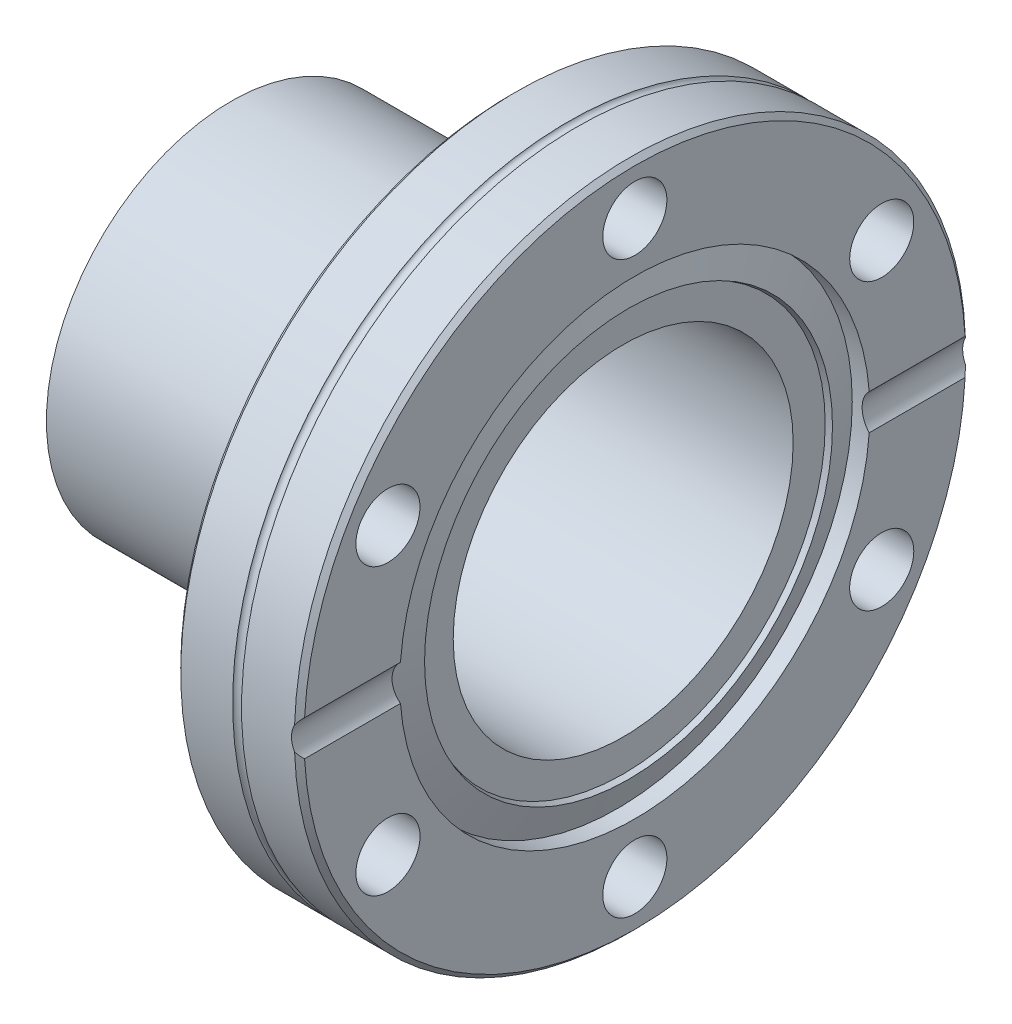
ISO-10303-21;
HEADER;
FILE_DESCRIPTION(('STEP AP214'),'2;1');
FILE_NAME('part.step','',(''),(''),'','','');
FILE_SCHEMA(('AUTOMOTIVE_DESIGN { 1 0 10303 214 1 1 1 1 }'));
ENDSEC;
DATA;
#1=APPLICATION_CONTEXT('core data for automotive mechanical design processes');
#2=APPLICATION_PROTOCOL_DEFINITION('international standard','automotive_design',2000,#1);
#3=PRODUCT_CONTEXT('',#1,'mechanical');
#4=PRODUCT('Part','Part','',(#3));
#5=PRODUCT_RELATED_PRODUCT_CATEGORY('part','',(#4));
#6=PRODUCT_DEFINITION_FORMATION('','',#4);
#7=PRODUCT_DEFINITION_CONTEXT('part definition',#1,'design');
#8=PRODUCT_DEFINITION('design','',#6,#7);
#9=PRODUCT_DEFINITION_SHAPE('','',#8);
#10=(LENGTH_UNIT() NAMED_UNIT(*) SI_UNIT(.MILLI.,.METRE.));
#11=(NAMED_UNIT(*) PLANE_ANGLE_UNIT() SI_UNIT($,.RADIAN.));
#12=(NAMED_UNIT(*) SI_UNIT($,.STERADIAN.) SOLID_ANGLE_UNIT());
#13=UNCERTAINTY_MEASURE_WITH_UNIT(LENGTH_MEASURE(1.E-05),#10,'distance_accuracy_value','');
#14=(GEOMETRIC_REPRESENTATION_CONTEXT(3) GLOBAL_UNCERTAINTY_ASSIGNED_CONTEXT((#13)) GLOBAL_UNIT_ASSIGNED_CONTEXT((#10,
#11,#12)) REPRESENTATION_CONTEXT('',''));
#15=CARTESIAN_POINT('',(0.,0.,0.));
#16=DIRECTION('',(0.,0.,1.));
#17=DIRECTION('',(1.,0.,0.));
#18=AXIS2_PLACEMENT_3D('',#15,#16,#17);
#19=CARTESIAN_POINT('',(-0.399999999999994,0.,0.));
#20=DIRECTION('',(-1.,0.,0.));
#21=DIRECTION('',(0.,0.,1.));
#22=AXIS2_PLACEMENT_3D('',#19,#20,#21);
#23=PLANE('',#22);
#24=CARTESIAN_POINT('',(-0.399999999999998,-14.6749999999998,-25.4178456010734));
#25=DIRECTION('',(1.,0.,0.));
#26=DIRECTION('',(0.,-0.866025403784443,0.499999999999992));
#27=AXIS2_PLACEMENT_3D('',#24,#25,#26);
#28=CIRCLE('',#27,3.3);
#29=CARTESIAN_POINT('',(-0.399999999999998,-17.5328838324884,-23.7678456010734));
#30=VERTEX_POINT('',#29);
#31=EDGE_CURVE('E427',#30,#30,#28,.T.);
#32=ORIENTED_EDGE('',*,*,#31,.F.);
#33=EDGE_LOOP('',(#32));
#34=FACE_BOUND('',#33,.T.);
#35=CARTESIAN_POINT('',(-0.399999999999998,-29.35,0.));
#36=DIRECTION('',(1.,0.,0.));
#37=DIRECTION('',(0.,0.,1.));
#38=AXIS2_PLACEMENT_3D('',#35,#36,#37);
#39=CIRCLE('',#38,3.3);
#40=CARTESIAN_POINT('',(-0.399999999999998,-29.35,3.3));
#41=VERTEX_POINT('',#40);
#42=EDGE_CURVE('E413',#41,#41,#39,.T.);
#43=ORIENTED_EDGE('',*,*,#42,.F.);
#44=EDGE_LOOP('',(#43));
#45=FACE_BOUND('',#44,.T.);
#46=CARTESIAN_POINT('',(-0.399999999999998,-14.6750000000001,25.4178456010732));
#47=DIRECTION('',(1.,0.,0.));
#48=DIRECTION('',(0.,0.866025403784436,0.500000000000004));
#49=AXIS2_PLACEMENT_3D('',#46,#47,#48);
#50=CIRCLE('',#49,3.3);
#51=CARTESIAN_POINT('',(-0.399999999999998,-11.8171161675115,27.0678456010732));
#52=VERTEX_POINT('',#51);
#53=EDGE_CURVE('E418',#52,#52,#50,.T.);
#54=ORIENTED_EDGE('',*,*,#53,.F.);
#55=EDGE_LOOP('',(#54));
#56=FACE_BOUND('',#55,.T.);
#57=CARTESIAN_POINT('',(-0.399999999999993,0.,0.));
#58=DIRECTION('',(1.,0.,0.));
#59=DIRECTION('',(0.,0.,-1.));
#60=AXIS2_PLACEMENT_3D('',#57,#58,#59);
#61=CIRCLE('',#60,24.2);
#62=CARTESIAN_POINT('',(-0.399999999999993,-1.83303027798234,24.1304786525257));
#63=VERTEX_POINT('',#62);
#64=CARTESIAN_POINT('',(-0.399999999999993,-1.83303027798234,-24.1304786525257));
#65=VERTEX_POINT('',#64);
#66=EDGE_CURVE('E121',#63,#65,#61,.T.);
#67=ORIENTED_EDGE('',*,*,#66,.F.);
#68=DIRECTION('',(0.,0.,1.));
#69=VECTOR('',#68,1.);
#70=CARTESIAN_POINT('',(-0.399999999999994,-1.83303027798234,22.55));
#71=LINE('',#70,#69);
#72=CARTESIAN_POINT('',(-0.399999999999993,-1.83303027798234,34.0006249942556));
#73=VERTEX_POINT('',#72);
#74=EDGE_CURVE('E358',#63,#73,#71,.T.);
#75=ORIENTED_EDGE('',*,*,#74,.T.);
#76=CARTESIAN_POINT('',(-0.399999999999995,0.,0.));
#77=DIRECTION('',(1.,0.,0.));
#78=DIRECTION('',(0.,0.,-1.));
#79=AXIS2_PLACEMENT_3D('',#76,#77,#78);
#80=CIRCLE('',#79,34.05);
#81=CARTESIAN_POINT('',(-0.399999999999992,-1.83303027798234,-34.0006249942556));
#82=VERTEX_POINT('',#81);
#83=EDGE_CURVE('E122',#73,#82,#80,.T.);
#84=ORIENTED_EDGE('',*,*,#83,.T.);
#85=DIRECTION('',(0.,0.,-1.));
#86=VECTOR('',#85,1.);
#87=CARTESIAN_POINT('',(-0.399999999999994,-1.83303027798234,-22.55));
#88=LINE('',#87,#86);
#89=EDGE_CURVE('E386',#82,#65,#88,.F.);
#90=ORIENTED_EDGE('',*,*,#89,.T.);
#91=EDGE_LOOP('',(#67,#75,#84,#90));
#92=FACE_BOUND('',#91,.T.);
#93=ADVANCED_FACE('F40',(#34,#45,#56,#92),#23,.F.);
#94=CARTESIAN_POINT('',(-0.899999999999997,0.,0.));
#95=DIRECTION('',(-1.,0.,0.));
#96=DIRECTION('',(0.,0.,1.));
#97=AXIS2_PLACEMENT_3D('',#94,#95,#96);
#98=CONICAL_SURFACE('',#97,34.55,0.785398163397447);
#99=ORIENTED_EDGE('',*,*,#83,.F.);
#100=CARTESIAN_POINT('',(-0.349799999999994,-1.87833968174023,33.9478753397028));
#101=CARTESIAN_POINT('',(-0.446088485751823,-1.79375267092949,34.0489753560395));
#102=CARTESIAN_POINT('',(-0.538882906449491,-1.69911106294885,34.1468054624246));
#103=CARTESIAN_POINT('',(-0.710846106412249,-1.4914360859607,34.3286335655153));
#104=CARTESIAN_POINT('',(-0.790235849458947,-1.37877674940881,34.4128546234636));
#105=CARTESIAN_POINT('',(-0.877045613769132,-1.22940249913029,34.5051617303354));
#106=CARTESIAN_POINT('',(-0.892237152831872,-1.20211621896156,34.5213246808093));
#107=CARTESIAN_POINT('',(-0.921839592104063,-1.1464847517294,34.5528360296043));
#108=CARTESIAN_POINT('',(-0.936247032075285,-1.11813567791065,34.5681808121166));
#109=CARTESIAN_POINT('',(-0.950199999998902,-1.08931169093431,34.5830484497813));
#110=B_SPLINE_CURVE_WITH_KNOTS('',3,(#100,#101,#102,#103,#104,#105,#106,#107,#108,#109),
.UNSPECIFIED.,.F.,.F.,(4,2,2,2,4),(0.,0.491209247735172,0.973299861574656,1.07876483351065,
1.1846627068575),.UNSPECIFIED.);
#111=CARTESIAN_POINT('',(-0.899999999999997,-1.18743420870379,34.5295887609453));
#112=VERTEX_POINT('',#111);
#113=EDGE_CURVE('E353',#73,#112,#110,.T.);
#114=ORIENTED_EDGE('',*,*,#113,.T.);
#115=CARTESIAN_POINT('',(-0.899999999999997,0.,0.));
#116=DIRECTION('',(1.,0.,0.));
#117=DIRECTION('',(0.,0.,-1.));
#118=AXIS2_PLACEMENT_3D('',#115,#116,#117);
#119=CIRCLE('',#118,34.55);
#120=CARTESIAN_POINT('',(-0.899999999999997,-1.18743420870379,-34.5295887609453));
#121=VERTEX_POINT('',#120);
#122=EDGE_CURVE('E68',#112,#121,#119,.T.);
#123=ORIENTED_EDGE('',*,*,#122,.T.);
#124=CARTESIAN_POINT('',(-0.950199999998735,-1.08931169093408,-34.5830484497811));
#125=CARTESIAN_POINT('',(-0.917787477184829,-1.15624387789586,-34.5485106768418));
#126=CARTESIAN_POINT('',(-0.882978035994132,-1.22055955078388,-34.5114586970576));
#127=CARTESIAN_POINT('',(-0.809273953485292,-1.34392340673215,-34.433115141082));
#128=CARTESIAN_POINT('',(-0.770385053178858,-1.40297878165412,-34.3918295246665));
#129=CARTESIAN_POINT('',(-0.649797010493098,-1.57068466258796,-34.2640075420487));
#130=CARTESIAN_POINT('',(-0.563110127890923,-1.67198155913603,-34.1723676674998));
#131=CARTESIAN_POINT('',(-0.45203457123279,-1.78358385530724,-34.0553670916165));
#132=CARTESIAN_POINT('',(-0.431918126962215,-1.80311907185186,-34.0341932651388));
#133=CARTESIAN_POINT('',(-0.391202586500277,-1.84136231524476,-33.9913705412528));
#134=CARTESIAN_POINT('',(-0.37060209004976,-1.86006732657126,-33.9697202812344));
#135=CARTESIAN_POINT('',(-0.349800000000003,-1.87833968174025,-33.9478753397028));
#136=B_SPLINE_CURVE_WITH_KNOTS('',3,(#124,#125,#126,#127,#128,#129,#130,#131,#132,#133,#134,
#135),.UNSPECIFIED.,.F.,.F.,(4,2,2,2,2,4),(0.,0.245660989600846,0.490980784863025,
0.973866334230536,1.07927829846846,1.18504616417979),.UNSPECIFIED.);
#137=EDGE_CURVE('E365',#121,#82,#136,.T.);
#138=ORIENTED_EDGE('',*,*,#137,.T.);
#139=EDGE_LOOP('',(#99,#114,#123,#138));
#140=FACE_BOUND('',#139,.T.);
#141=ADVANCED_FACE('F185',(#140),#98,.T.);
#142=CARTESIAN_POINT('',(-6.8,0.,0.));
#143=DIRECTION('',(1.,0.,0.));
#144=DIRECTION('',(0.,0.,-1.));
#145=AXIS2_PLACEMENT_3D('',#142,#143,#144);
#146=TOROIDAL_SURFACE('',#145,34.75,0.5);
#147=CARTESIAN_POINT('',(-6.34174243050441,0.,0.));
#148=DIRECTION('',(1.,0.,0.));
#149=DIRECTION('',(0.,0.,-1.));
#150=AXIS2_PLACEMENT_3D('',#147,#148,#149);
#151=CIRCLE('',#150,34.55);
#152=CARTESIAN_POINT('',(-6.34174243050441,0.,-34.55));
#153=VERTEX_POINT('',#152);
#154=EDGE_CURVE('E221',#153,#153,#151,.T.);
#155=ORIENTED_EDGE('',*,*,#154,.F.);
#156=EDGE_LOOP('',(#155));
#157=FACE_BOUND('',#156,.T.);
#158=CARTESIAN_POINT('',(-7.25825756949558,0.,0.));
#159=DIRECTION('',(1.,0.,0.));
#160=DIRECTION('',(0.,0.,-1.));
#161=AXIS2_PLACEMENT_3D('',#158,#159,#160);
#162=CIRCLE('',#161,34.55);
#163=CARTESIAN_POINT('',(-7.25825756949558,0.,-34.55));
#164=VERTEX_POINT('',#163);
#165=EDGE_CURVE('E53',#164,#164,#162,.T.);
#166=ORIENTED_EDGE('',*,*,#165,.T.);
#167=EDGE_LOOP('',(#166));
#168=FACE_BOUND('',#167,.T.);
#169=ADVANCED_FACE('F42',(#157,#168),#146,.F.);
#170=CARTESIAN_POINT('',(0.,0.,0.));
#171=DIRECTION('',(1.,0.,0.));
#172=DIRECTION('',(0.,0.,-1.));
#173=AXIS2_PLACEMENT_3D('',#170,#171,#172);
#174=CYLINDRICAL_SURFACE('',#173,34.55);
#175=ORIENTED_EDGE('',*,*,#165,.F.);
#176=EDGE_LOOP('',(#175));
#177=FACE_BOUND('',#176,.T.);
#178=CARTESIAN_POINT('',(-12.6,0.,0.));
#179=DIRECTION('',(1.,0.,0.));
#180=DIRECTION('',(0.,0.,-1.));
#181=AXIS2_PLACEMENT_3D('',#178,#179,#180);
#182=CIRCLE('',#181,34.55);
#183=CARTESIAN_POINT('',(-12.6,0.,-34.55));
#184=VERTEX_POINT('',#183);
#185=EDGE_CURVE('E147',#184,#184,#182,.T.);
#186=ORIENTED_EDGE('',*,*,#185,.T.);
#187=EDGE_LOOP('',(#186));
#188=FACE_BOUND('',#187,.T.);
#189=ADVANCED_FACE('F153',(#177,#188),#174,.T.);
#190=CARTESIAN_POINT('',(-13.1,0.,0.));
#191=DIRECTION('',(1.,0.,0.));
#192=DIRECTION('',(0.,0.,-1.));
#193=AXIS2_PLACEMENT_3D('',#190,#191,#192);
#194=CONICAL_SURFACE('',#193,34.05,0.785398163397448);
#195=ORIENTED_EDGE('',*,*,#185,.F.);
#196=EDGE_LOOP('',(#195));
#197=FACE_BOUND('',#196,.T.);
#198=CARTESIAN_POINT('',(-13.1,0.,0.));
#199=DIRECTION('',(1.,0.,0.));
#200=DIRECTION('',(0.,0.,-1.));
#201=AXIS2_PLACEMENT_3D('',#198,#199,#200);
#202=CIRCLE('',#201,34.05);
#203=CARTESIAN_POINT('',(-13.1,0.,-34.05));
#204=VERTEX_POINT('',#203);
#205=EDGE_CURVE('E144',#204,#204,#202,.T.);
#206=ORIENTED_EDGE('',*,*,#205,.T.);
#207=EDGE_LOOP('',(#206));
#208=FACE_BOUND('',#207,.T.);
#209=ADVANCED_FACE('F156',(#197,#208),#194,.T.);
#210=CARTESIAN_POINT('',(-13.1,0.,0.));
#211=DIRECTION('',(1.,0.,0.));
#212=DIRECTION('',(0.,0.,-1.));
#213=AXIS2_PLACEMENT_3D('',#210,#211,#212);
#214=PLANE('',#213);
#215=CARTESIAN_POINT('',(-13.1,-14.6750000000001,25.4178456010732));
#216=DIRECTION('',(1.,0.,0.));
#217=DIRECTION('',(0.,0.866025403784436,0.500000000000004));
#218=AXIS2_PLACEMENT_3D('',#215,#216,#217);
#219=CIRCLE('',#218,3.29999999999999);
#220=CARTESIAN_POINT('',(-13.1,-11.8171161675115,27.0678456010732));
#221=VERTEX_POINT('',#220);
#222=EDGE_CURVE('E421',#221,#221,#219,.T.);
#223=ORIENTED_EDGE('',*,*,#222,.T.);
#224=EDGE_LOOP('',(#223));
#225=FACE_BOUND('',#224,.T.);
#226=CARTESIAN_POINT('',(-13.1,-29.35,0.));
#227=DIRECTION('',(1.,0.,0.));
#228=DIRECTION('',(0.,0.,1.));
#229=AXIS2_PLACEMENT_3D('',#226,#227,#228);
#230=CIRCLE('',#229,3.29999999999999);
#231=CARTESIAN_POINT('',(-13.1,-29.35,3.29999999999999));
#232=VERTEX_POINT('',#231);
#233=EDGE_CURVE('E416',#232,#232,#230,.T.);
#234=ORIENTED_EDGE('',*,*,#233,.T.);
#235=EDGE_LOOP('',(#234));
#236=FACE_BOUND('',#235,.T.);
#237=CARTESIAN_POINT('',(-13.1,-14.6749999999998,-25.4178456010734));
#238=DIRECTION('',(1.,0.,0.));
#239=DIRECTION('',(0.,-0.866025403784443,0.499999999999992));
#240=AXIS2_PLACEMENT_3D('',#237,#238,#239);
#241=CIRCLE('',#240,3.29999999999999);
#242=CARTESIAN_POINT('',(-13.1,-17.5328838324884,-23.7678456010734));
#243=VERTEX_POINT('',#242);
#244=EDGE_CURVE('E423',#243,#243,#241,.T.);
#245=ORIENTED_EDGE('',*,*,#244,.T.);
#246=EDGE_LOOP('',(#245));
#247=FACE_BOUND('',#246,.T.);
#248=CARTESIAN_POINT('',(-13.1,14.6750000000003,-25.4178456010731));
#249=DIRECTION('',(1.,0.,0.));
#250=DIRECTION('',(0.,-0.866025403784433,-0.50000000000001));
#251=AXIS2_PLACEMENT_3D('',#248,#249,#250);
#252=CIRCLE('',#251,3.29999999999999);
#253=CARTESIAN_POINT('',(-13.1,11.8171161675117,-27.0678456010731));
#254=VERTEX_POINT('',#253);
#255=EDGE_CURVE('E430',#254,#254,#252,.T.);
#256=ORIENTED_EDGE('',*,*,#255,.T.);
#257=EDGE_LOOP('',(#256));
#258=FACE_BOUND('',#257,.T.);
#259=CARTESIAN_POINT('',(-13.1,14.6749999999999,25.4178456010733));
#260=DIRECTION('',(1.,0.,0.));
#261=DIRECTION('',(0.,0.86602540378444,-0.499999999999998));
#262=AXIS2_PLACEMENT_3D('',#259,#260,#261);
#263=CIRCLE('',#262,3.29999999999999);
#264=CARTESIAN_POINT('',(-13.1,17.5328838324886,23.7678456010733));
#265=VERTEX_POINT('',#264);
#266=EDGE_CURVE('E218',#265,#265,#263,.T.);
#267=ORIENTED_EDGE('',*,*,#266,.T.);
#268=EDGE_LOOP('',(#267));
#269=FACE_BOUND('',#268,.T.);
#270=CARTESIAN_POINT('',(-13.1,29.35,0.));
#271=DIRECTION('',(1.,0.,0.));
#272=DIRECTION('',(0.,0.,-1.));
#273=AXIS2_PLACEMENT_3D('',#270,#271,#272);
#274=CIRCLE('',#273,3.29999999999999);
#275=CARTESIAN_POINT('',(-13.1,29.35,-3.29999999999999));
#276=VERTEX_POINT('',#275);
#277=EDGE_CURVE('E217',#276,#276,#274,.T.);
#278=ORIENTED_EDGE('',*,*,#277,.T.);
#279=EDGE_LOOP('',(#278));
#280=FACE_BOUND('',#279,.T.);
#281=ORIENTED_EDGE('',*,*,#205,.F.);
#282=EDGE_LOOP('',(#281));
#283=FACE_BOUND('',#282,.T.);
#284=CARTESIAN_POINT('',(-13.1,0.,0.));
#285=DIRECTION('',(1.,0.,0.));
#286=DIRECTION('',(0.,0.,-1.));
#287=AXIS2_PLACEMENT_3D('',#284,#285,#286);
#288=CIRCLE('',#287,19.);
#289=CARTESIAN_POINT('',(-13.1,0.,-19.));
#290=VERTEX_POINT('',#289);
#291=EDGE_CURVE('E141',#290,#290,#288,.T.);
#292=ORIENTED_EDGE('',*,*,#291,.T.);
#293=EDGE_LOOP('',(#292));
#294=FACE_BOUND('',#293,.T.);
#295=ADVANCED_FACE('F161',(#225,#236,#247,#258,#269,#280,#283,#294),#214,.F.);
#296=CARTESIAN_POINT('',(0.,0.,0.));
#297=DIRECTION('',(1.,0.,0.));
#298=DIRECTION('',(0.,0.,-1.));
#299=AXIS2_PLACEMENT_3D('',#296,#297,#298);
#300=CYLINDRICAL_SURFACE('',#299,19.);
#301=CARTESIAN_POINT('',(-41.98,0.,0.));
#302=DIRECTION('',(1.,0.,0.));
#303=DIRECTION('',(0.,0.,-1.));
#304=AXIS2_PLACEMENT_3D('',#301,#302,#303);
#305=CIRCLE('',#304,19.);
#306=CARTESIAN_POINT('',(-41.98,0.,-19.));
#307=VERTEX_POINT('',#306);
#308=EDGE_CURVE('E510',#307,#307,#305,.T.);
#309=ORIENTED_EDGE('',*,*,#308,.T.);
#310=EDGE_LOOP('',(#309));
#311=FACE_BOUND('',#310,.T.);
#312=ORIENTED_EDGE('',*,*,#291,.F.);
#313=EDGE_LOOP('',(#312));
#314=FACE_BOUND('',#313,.T.);
#315=ADVANCED_FACE('F167',(#311,#314),#300,.T.);
#316=CARTESIAN_POINT('',(0.,0.,0.));
#317=DIRECTION('',(1.,0.,0.));
#318=DIRECTION('',(0.,0.,-1.));
#319=AXIS2_PLACEMENT_3D('',#316,#317,#318);
#320=CYLINDRICAL_SURFACE('',#319,17.5);
#321=CARTESIAN_POINT('',(-41.98,0.,0.));
#322=DIRECTION('',(1.,0.,0.));
#323=DIRECTION('',(0.,0.,-1.));
#324=AXIS2_PLACEMENT_3D('',#321,#322,#323);
#325=CIRCLE('',#324,17.5);
#326=CARTESIAN_POINT('',(-41.98,0.,-17.5));
#327=VERTEX_POINT('',#326);
#328=EDGE_CURVE('E106',#327,#327,#325,.T.);
#329=ORIENTED_EDGE('',*,*,#328,.F.);
#330=EDGE_LOOP('',(#329));
#331=FACE_BOUND('',#330,.T.);
#332=CARTESIAN_POINT('',(-1.59999999999999,0.,0.));
#333=DIRECTION('',(1.,0.,0.));
#334=DIRECTION('',(0.,0.,-1.));
#335=AXIS2_PLACEMENT_3D('',#332,#333,#334);
#336=CIRCLE('',#335,17.5);
#337=CARTESIAN_POINT('',(-1.59999999999999,0.,-17.5));
#338=VERTEX_POINT('',#337);
#339=EDGE_CURVE('E138',#338,#338,#336,.T.);
#340=ORIENTED_EDGE('',*,*,#339,.T.);
#341=EDGE_LOOP('',(#340));
#342=FACE_BOUND('',#341,.T.);
#343=ADVANCED_FACE('F173',(#331,#342),#320,.F.);
#344=CARTESIAN_POINT('',(-1.59999999999999,0.,0.));
#345=DIRECTION('',(-1.,0.,0.));
#346=DIRECTION('',(0.,0.,1.));
#347=AXIS2_PLACEMENT_3D('',#344,#345,#346);
#348=PLANE('',#347);
#349=ORIENTED_EDGE('',*,*,#339,.F.);
#350=EDGE_LOOP('',(#349));
#351=FACE_BOUND('',#350,.T.);
#352=CARTESIAN_POINT('',(-1.59999999999999,0.,0.));
#353=DIRECTION('',(1.,0.,0.));
#354=DIRECTION('',(0.,0.,-1.));
#355=AXIS2_PLACEMENT_3D('',#352,#353,#354);
#356=CIRCLE('',#355,20.7998163711536);
#357=CARTESIAN_POINT('',(-1.59999999999999,0.,-20.7998163711536));
#358=VERTEX_POINT('',#357);
#359=EDGE_CURVE('E135',#358,#358,#356,.T.);
#360=ORIENTED_EDGE('',*,*,#359,.T.);
#361=EDGE_LOOP('',(#360));
#362=FACE_BOUND('',#361,.T.);
#363=ADVANCED_FACE('F180',(#351,#362),#348,.F.);
#364=CARTESIAN_POINT('',(-1.04999999999999,0.,0.));
#365=DIRECTION('',(1.,0.,0.));
#366=DIRECTION('',(0.,0.,-1.));
#367=AXIS2_PLACEMENT_3D('',#364,#365,#366);
#368=CONICAL_SURFACE('',#367,21.,0.349065850398873);
#369=ORIENTED_EDGE('',*,*,#359,.F.);
#370=EDGE_LOOP('',(#369));
#371=FACE_BOUND('',#370,.T.);
#372=CARTESIAN_POINT('',(-1.04999999999999,0.,0.));
#373=DIRECTION('',(1.,0.,0.));
#374=DIRECTION('',(0.,0.,-1.));
#375=AXIS2_PLACEMENT_3D('',#372,#373,#374);
#376=CIRCLE('',#375,21.);
#377=CARTESIAN_POINT('',(-1.04999999999999,0.,-21.));
#378=VERTEX_POINT('',#377);
#379=EDGE_CURVE('E132',#378,#378,#376,.T.);
#380=ORIENTED_EDGE('',*,*,#379,.T.);
#381=EDGE_LOOP('',(#380));
#382=FACE_BOUND('',#381,.T.);
#383=ADVANCED_FACE('F267',(#371,#382),#368,.F.);
#384=CARTESIAN_POINT('',(-2.21470474965185,0.,0.));
#385=DIRECTION('',(-1.,0.,0.));
#386=DIRECTION('',(0.,0.,1.));
#387=AXIS2_PLACEMENT_3D('',#384,#385,#386);
#388=CONICAL_SURFACE('',#387,24.2,1.22173047639603);
#389=ORIENTED_EDGE('',*,*,#379,.F.);
#390=EDGE_LOOP('',(#389));
#391=FACE_BOUND('',#390,.T.);
#392=CARTESIAN_POINT('',(-2.21470474965185,0.,0.));
#393=DIRECTION('',(1.,0.,0.));
#394=DIRECTION('',(0.,0.,-1.));
#395=AXIS2_PLACEMENT_3D('',#392,#393,#394);
#396=CIRCLE('',#395,24.2);
#397=CARTESIAN_POINT('',(-2.21470474965185,0.,-24.2));
#398=VERTEX_POINT('',#397);
#399=EDGE_CURVE('E129',#398,#398,#396,.T.);
#400=ORIENTED_EDGE('',*,*,#399,.T.);
#401=EDGE_LOOP('',(#400));
#402=FACE_BOUND('',#401,.T.);
#403=ADVANCED_FACE('F203',(#391,#402),#388,.T.);
#404=CARTESIAN_POINT('',(0.,0.,0.));
#405=DIRECTION('',(1.,0.,0.));
#406=DIRECTION('',(0.,0.,-1.));
#407=AXIS2_PLACEMENT_3D('',#404,#405,#406);
#408=CYLINDRICAL_SURFACE('',#407,24.2);
#409=ORIENTED_EDGE('',*,*,#399,.F.);
#410=EDGE_LOOP('',(#409));
#411=FACE_BOUND('',#410,.T.);
#412=CARTESIAN_POINT('',(-0.399999999999993,1.83303027798234,-24.1304786525257));
#413=VERTEX_POINT('',#412);
#414=CARTESIAN_POINT('',(-0.399999999999993,1.83303027798234,24.1304786525257));
#415=VERTEX_POINT('',#414);
#416=EDGE_CURVE('E124',#413,#415,#61,.T.);
#417=ORIENTED_EDGE('',*,*,#416,.T.);
#418=CARTESIAN_POINT('',(-0.399999999999993,1.83303027798234,24.1304786525257));
#419=CARTESIAN_POINT('',(-0.451543869929938,1.78522615671699,24.1341098819552));
#420=CARTESIAN_POINT('',(-0.501045653372221,1.73527126956781,24.1377616719776));
#421=CARTESIAN_POINT('',(-0.595670317576881,1.63137261266511,24.1450065686099));
#422=CARTESIAN_POINT('',(-0.640793340526878,1.57742897253512,24.148599677122));
#423=CARTESIAN_POINT('',(-0.769030285438411,1.41024423612211,24.1591312340459));
#424=CARTESIAN_POINT('',(-0.845166488746499,1.29150585413633,24.1658332605734));
#425=CARTESIAN_POINT('',(-0.976451387749153,1.04286673620687,24.1778395892653));
#426=CARTESIAN_POINT('',(-1.03158817865363,0.912959719640096,24.1831430980727));
#427=CARTESIAN_POINT('',(-1.11926929194027,0.645678564435817,24.1917537675106));
#428=CARTESIAN_POINT('',(-1.15181848637547,0.508306042974973,24.1950613586325));
#429=CARTESIAN_POINT('',(-1.19330210191774,0.230464927710774,24.1993000657743));
#430=CARTESIAN_POINT('',(-1.2023127937642,0.0900078243944233,24.2002388569709));
#431=CARTESIAN_POINT('',(-1.1966785568969,-0.190434294482651,24.1996569541158));
#432=CARTESIAN_POINT('',(-1.18203252842345,-0.330419287792639,24.1981361457215));
#433=CARTESIAN_POINT('',(-1.12958742574298,-0.605523859489638,24.1928135299347));
#434=CARTESIAN_POINT('',(-1.09185374137268,-0.740656041933326,24.1890181652578));
#435=CARTESIAN_POINT('',(-0.994385715964053,-1.00266256017254,24.179575367122));
#436=CARTESIAN_POINT('',(-0.934651988592835,-1.12953712618909,24.1739279853236));
#437=CARTESIAN_POINT('',(-0.802371113511776,-1.35852551840343,24.162080406012));
#438=CARTESIAN_POINT('',(-0.731882863552868,-1.46183578315539,24.1560042899));
#439=CARTESIAN_POINT('',(-0.615284555032694,-1.60797377333368,24.1465694299708));
#440=CARTESIAN_POINT('',(-0.574598397577649,-1.65522362111741,24.1433703687091));
#441=CARTESIAN_POINT('',(-0.489809333913216,-1.74655767358892,24.1369349744007));
#442=CARTESIAN_POINT('',(-0.445706074216006,-1.79064154985615,24.1336986375276));
#443=CARTESIAN_POINT('',(-0.399999999999994,-1.83303027798234,24.1304786525257));
#444=B_SPLINE_CURVE_WITH_KNOTS('',3,(#418,#419,#420,#421,#422,#423,#424,#425,#426,#427,#428,
#429,#430,#431,#432,#433,#434,#435,#436,#437,#438,#439,#440,#441,#442,#443),.UNSPECIFIED.,.F.,
.F.,(4,2,2,2,2,2,2,2,2,2,2,2,4),(0.,0.211049968330813,0.422093081127725,0.843554110050339,
1.26525371531628,1.68686233339045,2.10710312795352,2.52736345934108,2.94643898619733,
3.36550282428589,3.7396618531304,3.92681495296951,4.11398743908772),.UNSPECIFIED.);
#445=EDGE_CURVE('E101',#415,#63,#444,.T.);
#446=ORIENTED_EDGE('',*,*,#445,.T.);
#447=ORIENTED_EDGE('',*,*,#66,.T.);
#448=CARTESIAN_POINT('',(-0.399999999999993,-1.83303027798234,-24.1304786525257));
#449=CARTESIAN_POINT('',(-0.451543869929938,-1.78522615671699,-24.1341098819552));
#450=CARTESIAN_POINT('',(-0.501045653372221,-1.73527126956781,-24.1377616719776));
#451=CARTESIAN_POINT('',(-0.595670317576881,-1.63137261266511,-24.1450065686099));
#452=CARTESIAN_POINT('',(-0.640793340526878,-1.57742897253512,-24.148599677122));
#453=CARTESIAN_POINT('',(-0.769030285438411,-1.41024423612211,-24.1591312340459));
#454=CARTESIAN_POINT('',(-0.845166488746499,-1.29150585413633,-24.1658332605734));
#455=CARTESIAN_POINT('',(-0.976451387749153,-1.04286673620687,-24.1778395892653));
#456=CARTESIAN_POINT('',(-1.03158817865363,-0.912959719640096,-24.1831430980727));
#457=CARTESIAN_POINT('',(-1.11926929194027,-0.645678564435817,-24.1917537675106));
#458=CARTESIAN_POINT('',(-1.15181848637547,-0.508306042974973,-24.1950613586325));
#459=CARTESIAN_POINT('',(-1.19330210191774,-0.230464927710774,-24.1993000657743));
#460=CARTESIAN_POINT('',(-1.2023127937642,-0.0900078243944233,-24.2002388569709));
#461=CARTESIAN_POINT('',(-1.1966785568969,0.190434294482651,-24.1996569541158));
#462=CARTESIAN_POINT('',(-1.18203252842345,0.330419287792639,-24.1981361457215));
#463=CARTESIAN_POINT('',(-1.12958742574298,0.605523859489638,-24.1928135299347));
#464=CARTESIAN_POINT('',(-1.09185374137268,0.740656041933326,-24.1890181652578));
#465=CARTESIAN_POINT('',(-0.994385715964053,1.00266256017254,-24.179575367122));
#466=CARTESIAN_POINT('',(-0.934651988592835,1.12953712618909,-24.1739279853236));
#467=CARTESIAN_POINT('',(-0.802371113511776,1.35852551840343,-24.162080406012));
#468=CARTESIAN_POINT('',(-0.731882863552868,1.46183578315539,-24.1560042899));
#469=CARTESIAN_POINT('',(-0.615284555032694,1.60797377333368,-24.1465694299708));
#470=CARTESIAN_POINT('',(-0.574598397577649,1.65522362111741,-24.1433703687091));
#471=CARTESIAN_POINT('',(-0.489809333913216,1.74655767358892,-24.1369349744007));
#472=CARTESIAN_POINT('',(-0.445706074216006,1.79064154985615,-24.1336986375276));
#473=CARTESIAN_POINT('',(-0.399999999999994,1.83303027798234,-24.1304786525257));
#474=B_SPLINE_CURVE_WITH_KNOTS('',3,(#448,#449,#450,#451,#452,#453,#454,#455,#456,#457,#458,
#459,#460,#461,#462,#463,#464,#465,#466,#467,#468,#469,#470,#471,#472,#473),.UNSPECIFIED.,.F.,
.F.,(4,2,2,2,2,2,2,2,2,2,2,2,4),(0.,0.211049968330813,0.422093081127725,0.843554110050339,
1.26525371531628,1.68686233339045,2.10710312795352,2.52736345934108,2.94643898619733,
3.36550282428589,3.7396618531304,3.92681495296951,4.11398743908772),.UNSPECIFIED.);
#475=EDGE_CURVE('E434',#65,#413,#474,.T.);
#476=ORIENTED_EDGE('',*,*,#475,.T.);
#477=EDGE_LOOP('',(#417,#446,#447,#476));
#478=FACE_BOUND('',#477,.T.);
#479=ADVANCED_FACE('F196',(#411,#478),#408,.F.);
#480=CARTESIAN_POINT('',(-0.399999999999998,14.6750000000003,-25.4178456010731));
#481=DIRECTION('',(1.,0.,0.));
#482=DIRECTION('',(0.,-0.866025403784433,-0.50000000000001));
#483=AXIS2_PLACEMENT_3D('',#480,#481,#482);
#484=CIRCLE('',#483,3.3);
#485=CARTESIAN_POINT('',(-0.399999999999998,11.8171161675117,-27.0678456010731));
#486=VERTEX_POINT('',#485);
#487=EDGE_CURVE('E208',#486,#486,#484,.T.);
#488=ORIENTED_EDGE('',*,*,#487,.F.);
#489=EDGE_LOOP('',(#488));
#490=FACE_BOUND('',#489,.T.);
#491=CARTESIAN_POINT('',(-0.399999999999998,14.6749999999999,25.4178456010733));
#492=DIRECTION('',(1.,0.,0.));
#493=DIRECTION('',(0.,0.86602540378444,-0.499999999999998));
#494=AXIS2_PLACEMENT_3D('',#491,#492,#493);
#495=CIRCLE('',#494,3.3);
#496=CARTESIAN_POINT('',(-0.399999999999998,17.5328838324886,23.7678456010733));
#497=VERTEX_POINT('',#496);
#498=EDGE_CURVE('E212',#497,#497,#495,.T.);
#499=ORIENTED_EDGE('',*,*,#498,.F.);
#500=EDGE_LOOP('',(#499));
#501=FACE_BOUND('',#500,.T.);
#502=CARTESIAN_POINT('',(-0.399999999999998,29.35,0.));
#503=DIRECTION('',(1.,0.,0.));
#504=DIRECTION('',(0.,0.,-1.));
#505=AXIS2_PLACEMENT_3D('',#502,#503,#504);
#506=CIRCLE('',#505,3.3);
#507=CARTESIAN_POINT('',(-0.399999999999998,29.35,-3.3));
#508=VERTEX_POINT('',#507);
#509=EDGE_CURVE('E215',#508,#508,#506,.T.);
#510=ORIENTED_EDGE('',*,*,#509,.F.);
#511=EDGE_LOOP('',(#510));
#512=FACE_BOUND('',#511,.T.);
#513=CARTESIAN_POINT('',(-0.399999999999993,1.83303027798234,-34.0006249942556));
#514=VERTEX_POINT('',#513);
#515=CARTESIAN_POINT('',(-0.399999999999992,1.83303027798234,34.0006249942556));
#516=VERTEX_POINT('',#515);
#517=EDGE_CURVE('E113',#514,#516,#80,.T.);
#518=ORIENTED_EDGE('',*,*,#517,.T.);
#519=DIRECTION('',(0.,0.,1.));
#520=VECTOR('',#519,1.);
#521=CARTESIAN_POINT('',(-0.399999999999994,1.83303027798234,22.55));
#522=LINE('',#521,#520);
#523=EDGE_CURVE('E98',#516,#415,#522,.F.);
#524=ORIENTED_EDGE('',*,*,#523,.T.);
#525=ORIENTED_EDGE('',*,*,#416,.F.);
#526=DIRECTION('',(0.,0.,-1.));
#527=VECTOR('',#526,1.);
#528=CARTESIAN_POINT('',(-0.399999999999994,1.83303027798234,-22.55));
#529=LINE('',#528,#527);
#530=EDGE_CURVE('E120',#413,#514,#529,.T.);
#531=ORIENTED_EDGE('',*,*,#530,.T.);
#532=EDGE_LOOP('',(#518,#524,#525,#531));
#533=FACE_BOUND('',#532,.T.);
#534=ADVANCED_FACE('F119',(#490,#501,#512,#533),#23,.F.);
#535=CARTESIAN_POINT('',(-0.899999999999997,1.18743420870379,-34.5295887609453));
#536=VERTEX_POINT('',#535);
#537=CARTESIAN_POINT('',(-0.899999999999997,1.18743420870379,34.5295887609453));
#538=VERTEX_POINT('',#537);
#539=EDGE_CURVE('E115',#536,#538,#119,.T.);
#540=ORIENTED_EDGE('',*,*,#539,.T.);
#541=CARTESIAN_POINT('',(-0.950199999998735,1.08931169093408,34.5830484497811));
#542=CARTESIAN_POINT('',(-0.917787477184829,1.15624387789586,34.5485106768418));
#543=CARTESIAN_POINT('',(-0.882978035994132,1.22055955078388,34.5114586970576));
#544=CARTESIAN_POINT('',(-0.809273953485292,1.34392340673215,34.433115141082));
#545=CARTESIAN_POINT('',(-0.770385053178858,1.40297878165412,34.3918295246665));
#546=CARTESIAN_POINT('',(-0.649797010493098,1.57068466258796,34.2640075420487));
#547=CARTESIAN_POINT('',(-0.563110127890923,1.67198155913603,34.1723676674998));
#548=CARTESIAN_POINT('',(-0.45203457123279,1.78358385530724,34.0553670916165));
#549=CARTESIAN_POINT('',(-0.431918126962215,1.80311907185186,34.0341932651388));
#550=CARTESIAN_POINT('',(-0.391202586500277,1.84136231524476,33.9913705412528));
#551=CARTESIAN_POINT('',(-0.37060209004976,1.86006732657126,33.9697202812344));
#552=CARTESIAN_POINT('',(-0.349800000000003,1.87833968174025,33.9478753397028));
#553=B_SPLINE_CURVE_WITH_KNOTS('',3,(#541,#542,#543,#544,#545,#546,#547,#548,#549,#550,#551,
#552),.UNSPECIFIED.,.F.,.F.,(4,2,2,2,2,4),(0.,0.245660989600846,0.490980784863025,
0.973866334230536,1.07927829846846,1.18504616417979),.UNSPECIFIED.);
#554=EDGE_CURVE('E60',#538,#516,#553,.T.);
#555=ORIENTED_EDGE('',*,*,#554,.T.);
#556=ORIENTED_EDGE('',*,*,#517,.F.);
#557=CARTESIAN_POINT('',(-0.349799999999994,1.87833968174023,-33.9478753397028));
#558=CARTESIAN_POINT('',(-0.446088485751823,1.79375267092949,-34.0489753560395));
#559=CARTESIAN_POINT('',(-0.538882906449491,1.69911106294885,-34.1468054624246));
#560=CARTESIAN_POINT('',(-0.710846106412249,1.4914360859607,-34.3286335655153));
#561=CARTESIAN_POINT('',(-0.790235849458947,1.37877674940881,-34.4128546234636));
#562=CARTESIAN_POINT('',(-0.877045613769132,1.22940249913029,-34.5051617303354));
#563=CARTESIAN_POINT('',(-0.892237152831872,1.20211621896156,-34.5213246808093));
#564=CARTESIAN_POINT('',(-0.921839592104063,1.1464847517294,-34.5528360296043));
#565=CARTESIAN_POINT('',(-0.936247032075285,1.11813567791065,-34.5681808121166));
#566=CARTESIAN_POINT('',(-0.950199999998902,1.08931169093431,-34.5830484497813));
#567=B_SPLINE_CURVE_WITH_KNOTS('',3,(#557,#558,#559,#560,#561,#562,#563,#564,#565,#566),
.UNSPECIFIED.,.F.,.F.,(4,2,2,2,4),(0.,0.491209247735172,0.973299861574656,1.07876483351065,
1.1846627068575),.UNSPECIFIED.);
#568=EDGE_CURVE('E381',#514,#536,#567,.T.);
#569=ORIENTED_EDGE('',*,*,#568,.T.);
#570=EDGE_LOOP('',(#540,#555,#556,#569));
#571=FACE_BOUND('',#570,.T.);
#572=ADVANCED_FACE('F111',(#571),#98,.T.);
#573=CARTESIAN_POINT('',(0.,0.,0.));
#574=DIRECTION('',(1.,0.,0.));
#575=DIRECTION('',(0.,0.,-1.));
#576=AXIS2_PLACEMENT_3D('',#573,#574,#575);
#577=CYLINDRICAL_SURFACE('',#576,34.55);
#578=ORIENTED_EDGE('',*,*,#122,.F.);
#579=CARTESIAN_POINT('',(-0.899999999999997,-1.18743420870379,34.5295887609453));
#580=CARTESIAN_POINT('',(-0.933415555160182,-1.12554003210284,34.5317188250281));
#581=CARTESIAN_POINT('',(-0.964207233179754,-1.06222610700349,34.5337279984193));
#582=CARTESIAN_POINT('',(-1.02036328323443,-0.933196949065755,34.5374547539194));
#583=CARTESIAN_POINT('',(-1.0457254824079,-0.867480767122589,34.5391722192309));
#584=CARTESIAN_POINT('',(-1.09068406770277,-0.73452569751712,34.5422549183647));
#585=CARTESIAN_POINT('',(-1.11031333138526,-0.667297973155822,34.5436221549072));
#586=CARTESIAN_POINT('',(-1.14385812089832,-0.531459514081518,34.5459789474982));
#587=CARTESIAN_POINT('',(-1.15777637606023,-0.462849456481286,34.5469686839406));
#588=CARTESIAN_POINT('',(-1.17916872328868,-0.328724853710707,34.5484973514992));
#589=CARTESIAN_POINT('',(-1.18697113516625,-0.263262968764587,34.5490591958107));
#590=CARTESIAN_POINT('',(-1.19739078099273,-0.131877896744313,34.54981101004));
#591=CARTESIAN_POINT('',(-1.20000304335274,-0.0659543280132875,34.5500006233998));
#592=CARTESIAN_POINT('',(-1.19999352985118,0.140218486902471,34.5499986746559));
#593=CARTESIAN_POINT('',(-1.18816627205777,0.280576001124747,34.5491375078308));
#594=CARTESIAN_POINT('',(-1.1411170569972,0.557377381524419,34.5457815107007));
#595=CARTESIAN_POINT('',(-1.10588082118951,0.693818806022322,34.5432856833313));
#596=CARTESIAN_POINT('',(-1.03771991052801,0.888501590560207,34.53863024155));
#597=CARTESIAN_POINT('',(-1.013450358166,0.949895954457274,34.5369923516472));
#598=CARTESIAN_POINT('',(-0.960211574125663,1.07040515731071,34.5334672057696));
#599=CARTESIAN_POINT('',(-0.931255290293085,1.12952573637957,34.5315806393951));
#600=CARTESIAN_POINT('',(-0.900000000000092,1.18743420870382,34.5295887609453));
#601=B_SPLINE_CURVE_WITH_KNOTS('',3,(#579,#580,#581,#582,#583,#584,#585,#586,#587,#588,#589,
#590,#591,#592,#593,#594,#595,#596,#597,#598,#599,#600),.UNSPECIFIED.,.F.,.F.,(4,2,2,2,2,2,2,2,
2,2,4),(0.,0.21104826094006,0.422180825538799,0.632077665766163,0.841874077648661,
1.03944232973318,1.23719973927562,1.65763074926494,2.07831844110087,2.27625318062816,
2.47365014551799),.UNSPECIFIED.);
#602=EDGE_CURVE('E116',#112,#538,#601,.T.);
#603=ORIENTED_EDGE('',*,*,#602,.T.);
#604=ORIENTED_EDGE('',*,*,#539,.F.);
#605=CARTESIAN_POINT('',(-0.899999999999997,1.18743420870379,-34.5295887609453));
#606=CARTESIAN_POINT('',(-0.933415555160182,1.12554003210284,-34.5317188250281));
#607=CARTESIAN_POINT('',(-0.964207233179754,1.06222610700349,-34.5337279984193));
#608=CARTESIAN_POINT('',(-1.02036328323443,0.933196949065755,-34.5374547539194));
#609=CARTESIAN_POINT('',(-1.0457254824079,0.867480767122589,-34.5391722192309));
#610=CARTESIAN_POINT('',(-1.09068406770277,0.73452569751712,-34.5422549183647));
#611=CARTESIAN_POINT('',(-1.11031333138526,0.667297973155822,-34.5436221549072));
#612=CARTESIAN_POINT('',(-1.14385812089832,0.531459514081518,-34.5459789474982));
#613=CARTESIAN_POINT('',(-1.15777637606023,0.462849456481286,-34.5469686839406));
#614=CARTESIAN_POINT('',(-1.17916872328868,0.328724853710707,-34.5484973514992));
#615=CARTESIAN_POINT('',(-1.18697113516625,0.263262968764587,-34.5490591958107));
#616=CARTESIAN_POINT('',(-1.19739078099273,0.131877896744313,-34.54981101004));
#617=CARTESIAN_POINT('',(-1.20000304335274,0.0659543280132875,-34.5500006233998));
#618=CARTESIAN_POINT('',(-1.19999352985118,-0.140218486902471,-34.5499986746559));
#619=CARTESIAN_POINT('',(-1.18816627205777,-0.280576001124747,-34.5491375078308));
#620=CARTESIAN_POINT('',(-1.1411170569972,-0.557377381524419,-34.5457815107007));
#621=CARTESIAN_POINT('',(-1.10588082118951,-0.693818806022322,-34.5432856833313));
#622=CARTESIAN_POINT('',(-1.03771991052801,-0.888501590560207,-34.53863024155));
#623=CARTESIAN_POINT('',(-1.013450358166,-0.949895954457274,-34.5369923516472));
#624=CARTESIAN_POINT('',(-0.960211574125663,-1.07040515731071,-34.5334672057696));
#625=CARTESIAN_POINT('',(-0.931255290293085,-1.12952573637957,-34.5315806393951));
#626=CARTESIAN_POINT('',(-0.900000000000092,-1.18743420870382,-34.5295887609453));
#627=B_SPLINE_CURVE_WITH_KNOTS('',3,(#605,#606,#607,#608,#609,#610,#611,#612,#613,#614,#615,
#616,#617,#618,#619,#620,#621,#622,#623,#624,#625,#626),.UNSPECIFIED.,.F.,.F.,(4,2,2,2,2,2,2,2,
2,2,4),(0.,0.21104826094006,0.422180825538799,0.632077665766163,0.841874077648661,
1.03944232973318,1.23719973927562,1.65763074926494,2.07831844110087,2.27625318062816,
2.47365014551799),.UNSPECIFIED.);
#628=EDGE_CURVE('E11',#536,#121,#627,.T.);
#629=ORIENTED_EDGE('',*,*,#628,.T.);
#630=EDGE_LOOP('',(#578,#603,#604,#629));
#631=FACE_BOUND('',#630,.T.);
#632=ORIENTED_EDGE('',*,*,#154,.T.);
#633=EDGE_LOOP('',(#632));
#634=FACE_BOUND('',#633,.T.);
#635=ADVANCED_FACE('F202',(#631,#634),#577,.T.);
#636=CARTESIAN_POINT('',(-0.399999999999998,29.35,0.));
#637=DIRECTION('',(1.,0.,0.));
#638=DIRECTION('',(0.,0.,-1.));
#639=AXIS2_PLACEMENT_3D('',#636,#637,#638);
#640=CYLINDRICAL_SURFACE('',#639,3.29999999999999);
#641=ORIENTED_EDGE('',*,*,#509,.T.);
#642=EDGE_LOOP('',(#641));
#643=FACE_BOUND('',#642,.T.);
#644=ORIENTED_EDGE('',*,*,#277,.F.);
#645=EDGE_LOOP('',(#644));
#646=FACE_BOUND('',#645,.T.);
#647=ADVANCED_FACE('F306',(#643,#646),#640,.F.);
#648=CARTESIAN_POINT('',(-0.399999999999998,14.6749999999999,25.4178456010733));
#649=DIRECTION('',(1.,0.,0.));
#650=DIRECTION('',(0.,0.86602540378444,-0.499999999999998));
#651=AXIS2_PLACEMENT_3D('',#648,#649,#650);
#652=CYLINDRICAL_SURFACE('',#651,3.29999999999999);
#653=ORIENTED_EDGE('',*,*,#498,.T.);
#654=EDGE_LOOP('',(#653));
#655=FACE_BOUND('',#654,.T.);
#656=ORIENTED_EDGE('',*,*,#266,.F.);
#657=EDGE_LOOP('',(#656));
#658=FACE_BOUND('',#657,.T.);
#659=ADVANCED_FACE('F393',(#655,#658),#652,.F.);
#660=CARTESIAN_POINT('',(-0.399999999999998,14.6750000000003,-25.4178456010731));
#661=DIRECTION('',(1.,0.,0.));
#662=DIRECTION('',(0.,-0.866025403784433,-0.50000000000001));
#663=AXIS2_PLACEMENT_3D('',#660,#661,#662);
#664=CYLINDRICAL_SURFACE('',#663,3.29999999999999);
#665=ORIENTED_EDGE('',*,*,#487,.T.);
#666=EDGE_LOOP('',(#665));
#667=FACE_BOUND('',#666,.T.);
#668=ORIENTED_EDGE('',*,*,#255,.F.);
#669=EDGE_LOOP('',(#668));
#670=FACE_BOUND('',#669,.T.);
#671=ADVANCED_FACE('F396',(#667,#670),#664,.F.);
#672=CARTESIAN_POINT('',(-0.399999999999998,-14.6749999999998,-25.4178456010734));
#673=DIRECTION('',(1.,0.,0.));
#674=DIRECTION('',(0.,-0.866025403784443,0.499999999999992));
#675=AXIS2_PLACEMENT_3D('',#672,#673,#674);
#676=CYLINDRICAL_SURFACE('',#675,3.29999999999999);
#677=ORIENTED_EDGE('',*,*,#31,.T.);
#678=EDGE_LOOP('',(#677));
#679=FACE_BOUND('',#678,.T.);
#680=ORIENTED_EDGE('',*,*,#244,.F.);
#681=EDGE_LOOP('',(#680));
#682=FACE_BOUND('',#681,.T.);
#683=ADVANCED_FACE('F400',(#679,#682),#676,.F.);
#684=CARTESIAN_POINT('',(-0.399999999999998,-29.35,0.));
#685=DIRECTION('',(1.,0.,0.));
#686=DIRECTION('',(0.,0.,1.));
#687=AXIS2_PLACEMENT_3D('',#684,#685,#686);
#688=CYLINDRICAL_SURFACE('',#687,3.29999999999999);
#689=ORIENTED_EDGE('',*,*,#42,.T.);
#690=EDGE_LOOP('',(#689));
#691=FACE_BOUND('',#690,.T.);
#692=ORIENTED_EDGE('',*,*,#233,.F.);
#693=EDGE_LOOP('',(#692));
#694=FACE_BOUND('',#693,.T.);
#695=ADVANCED_FACE('F403',(#691,#694),#688,.F.);
#696=CARTESIAN_POINT('',(-0.399999999999998,-14.6750000000001,25.4178456010732));
#697=DIRECTION('',(1.,0.,0.));
#698=DIRECTION('',(0.,0.866025403784436,0.500000000000004));
#699=AXIS2_PLACEMENT_3D('',#696,#697,#698);
#700=CYLINDRICAL_SURFACE('',#699,3.29999999999999);
#701=ORIENTED_EDGE('',*,*,#53,.T.);
#702=EDGE_LOOP('',(#701));
#703=FACE_BOUND('',#702,.T.);
#704=ORIENTED_EDGE('',*,*,#222,.F.);
#705=EDGE_LOOP('',(#704));
#706=FACE_BOUND('',#705,.T.);
#707=ADVANCED_FACE('F374',(#703,#706),#700,.F.);
#708=CARTESIAN_POINT('',(1.30000000000001,0.,-22.55));
#709=DIRECTION('',(0.,0.,-1.));
#710=DIRECTION('',(-1.,0.,0.));
#711=AXIS2_PLACEMENT_3D('',#708,#709,#710);
#712=CYLINDRICAL_SURFACE('',#711,2.5);
#713=ORIENTED_EDGE('',*,*,#89,.F.);
#714=ORIENTED_EDGE('',*,*,#137,.F.);
#715=ORIENTED_EDGE('',*,*,#628,.F.);
#716=ORIENTED_EDGE('',*,*,#568,.F.);
#717=ORIENTED_EDGE('',*,*,#530,.F.);
#718=ORIENTED_EDGE('',*,*,#475,.F.);
#719=EDGE_LOOP('',(#713,#714,#715,#716,#717,#718));
#720=FACE_BOUND('',#719,.T.);
#721=ADVANCED_FACE('F317',(#720),#712,.F.);
#722=CARTESIAN_POINT('',(1.30000000000001,0.,22.55));
#723=DIRECTION('',(0.,0.,1.));
#724=DIRECTION('',(-1.,0.,0.));
#725=AXIS2_PLACEMENT_3D('',#722,#723,#724);
#726=CYLINDRICAL_SURFACE('',#725,2.5);
#727=ORIENTED_EDGE('',*,*,#523,.F.);
#728=ORIENTED_EDGE('',*,*,#554,.F.);
#729=ORIENTED_EDGE('',*,*,#602,.F.);
#730=ORIENTED_EDGE('',*,*,#113,.F.);
#731=ORIENTED_EDGE('',*,*,#74,.F.);
#732=ORIENTED_EDGE('',*,*,#445,.F.);
#733=EDGE_LOOP('',(#727,#728,#729,#730,#731,#732));
#734=FACE_BOUND('',#733,.T.);
#735=ADVANCED_FACE('F99',(#734),#726,.F.);
#736=CARTESIAN_POINT('',(-41.98,19.,0.));
#737=DIRECTION('',(1.,0.,0.));
#738=DIRECTION('',(0.,0.,-1.));
#739=AXIS2_PLACEMENT_3D('',#736,#737,#738);
#740=PLANE('',#739);
#741=ORIENTED_EDGE('',*,*,#308,.F.);
#742=EDGE_LOOP('',(#741));
#743=FACE_BOUND('',#742,.T.);
#744=ORIENTED_EDGE('',*,*,#328,.T.);
#745=EDGE_LOOP('',(#744));
#746=FACE_BOUND('',#745,.T.);
#747=ADVANCED_FACE('F316',(#743,#746),#740,.F.);
#748=CLOSED_SHELL('',(#93,#141,#169,#189,#209,#295,#315,#343,#363,#383,#403,#479,#534,#572,#635,
#647,#659,#671,#683,#695,#707,#721,#735,#747));
#749=MANIFOLD_SOLID_BREP('B2',#748);
#750=ADVANCED_BREP_SHAPE_REPRESENTATION('',(#18,#749),#14);
#751=SHAPE_DEFINITION_REPRESENTATION(#9,#750);
ENDSEC;
END-ISO-10303-21;
